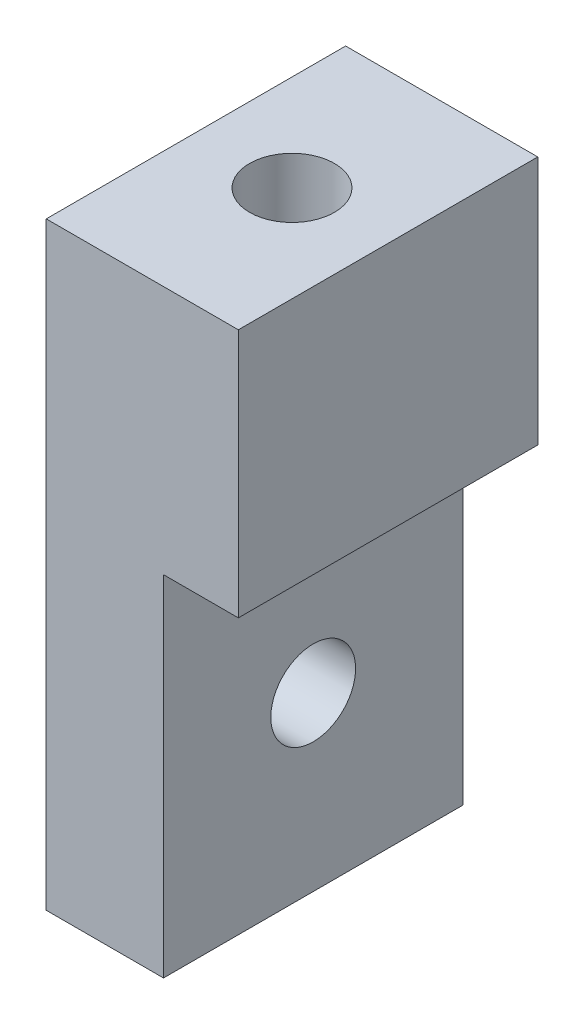
ISO-10303-21;
HEADER;
FILE_DESCRIPTION(('STEP AP214'),'2;1');
FILE_NAME('part.step','',(''),(''),'','','');
FILE_SCHEMA(('AUTOMOTIVE_DESIGN { 1 0 10303 214 1 1 1 1 }'));
ENDSEC;
DATA;
#1=APPLICATION_CONTEXT('core data for automotive mechanical design processes');
#2=APPLICATION_PROTOCOL_DEFINITION('international standard','automotive_design',2000,#1);
#3=PRODUCT_CONTEXT('',#1,'mechanical');
#4=PRODUCT('Part','Part','',(#3));
#5=PRODUCT_RELATED_PRODUCT_CATEGORY('part','',(#4));
#6=PRODUCT_DEFINITION_FORMATION('','',#4);
#7=PRODUCT_DEFINITION_CONTEXT('part definition',#1,'design');
#8=PRODUCT_DEFINITION('design','',#6,#7);
#9=PRODUCT_DEFINITION_SHAPE('','',#8);
#10=(LENGTH_UNIT() NAMED_UNIT(*) SI_UNIT(.MILLI.,.METRE.));
#11=(NAMED_UNIT(*) PLANE_ANGLE_UNIT() SI_UNIT($,.RADIAN.));
#12=(NAMED_UNIT(*) SI_UNIT($,.STERADIAN.) SOLID_ANGLE_UNIT());
#13=UNCERTAINTY_MEASURE_WITH_UNIT(LENGTH_MEASURE(1.E-05),#10,'distance_accuracy_value','');
#14=(GEOMETRIC_REPRESENTATION_CONTEXT(3) GLOBAL_UNCERTAINTY_ASSIGNED_CONTEXT((#13)) GLOBAL_UNIT_ASSIGNED_CONTEXT((#10,
#11,#12)) REPRESENTATION_CONTEXT('',''));
#15=CARTESIAN_POINT('',(0.,0.,0.));
#16=DIRECTION('',(0.,0.,1.));
#17=DIRECTION('',(1.,0.,0.));
#18=AXIS2_PLACEMENT_3D('',#15,#16,#17);
#19=CARTESIAN_POINT('',(0.425000000000001,0.,6.));
#20=DIRECTION('',(-1.,0.,0.));
#21=DIRECTION('',(0.,0.,1.));
#22=AXIS2_PLACEMENT_3D('',#19,#20,#21);
#23=PLANE('',#22);
#24=CARTESIAN_POINT('',(0.425000000000001,-2.55134747032304,3.));
#25=DIRECTION('',(-1.,0.,0.));
#26=DIRECTION('',(0.,0.,1.));
#27=AXIS2_PLACEMENT_3D('',#24,#25,#26);
#28=CIRCLE('',#27,0.85);
#29=CARTESIAN_POINT('',(0.425000000000001,-2.55134747032304,3.85));
#30=VERTEX_POINT('',#29);
#31=EDGE_CURVE('E133',#30,#30,#28,.T.);
#32=ORIENTED_EDGE('',*,*,#31,.T.);
#33=EDGE_LOOP('',(#32));
#34=FACE_BOUND('',#33,.T.);
#35=DIRECTION('',(0.,1.,0.));
#36=VECTOR('',#35,1.);
#37=CARTESIAN_POINT('',(0.425000000000001,0.,0.));
#38=LINE('',#37,#36);
#39=CARTESIAN_POINT('',(0.425000000000001,-6.,0.));
#40=VERTEX_POINT('',#39);
#41=CARTESIAN_POINT('',(0.425000000000001,1.,0.));
#42=VERTEX_POINT('',#41);
#43=EDGE_CURVE('E129',#40,#42,#38,.T.);
#44=ORIENTED_EDGE('',*,*,#43,.T.);
#45=DIRECTION('',(0.,0.,-1.));
#46=VECTOR('',#45,1.);
#47=CARTESIAN_POINT('',(0.425000000000001,1.,6.));
#48=LINE('',#47,#46);
#49=CARTESIAN_POINT('',(0.425000000000001,1.,2.26387840678323));
#50=VERTEX_POINT('',#49);
#51=EDGE_CURVE('E43',#50,#42,#48,.T.);
#52=ORIENTED_EDGE('',*,*,#51,.F.);
#53=CARTESIAN_POINT('',(0.425000000000001,1.,3.73612159321677));
#54=VERTEX_POINT('',#53);
#55=EDGE_CURVE('E42',#54,#50,#48,.T.);
#56=ORIENTED_EDGE('',*,*,#55,.F.);
#57=CARTESIAN_POINT('',(0.425000000000001,1.,6.));
#58=VERTEX_POINT('',#57);
#59=EDGE_CURVE('E11',#58,#54,#48,.T.);
#60=ORIENTED_EDGE('',*,*,#59,.F.);
#61=DIRECTION('',(0.,1.,0.));
#62=VECTOR('',#61,1.);
#63=CARTESIAN_POINT('',(0.425000000000001,0.,6.));
#64=LINE('',#63,#62);
#65=CARTESIAN_POINT('',(0.425000000000001,-6.,6.));
#66=VERTEX_POINT('',#65);
#67=EDGE_CURVE('E143',#66,#58,#64,.T.);
#68=ORIENTED_EDGE('',*,*,#67,.F.);
#69=DIRECTION('',(0.,0.,-1.));
#70=VECTOR('',#69,1.);
#71=CARTESIAN_POINT('',(0.425000000000001,-6.,6.));
#72=LINE('',#71,#70);
#73=EDGE_CURVE('E128',#66,#40,#72,.T.);
#74=ORIENTED_EDGE('',*,*,#73,.T.);
#75=EDGE_LOOP('',(#44,#52,#56,#60,#68,#74));
#76=FACE_BOUND('',#75,.T.);
#77=ADVANCED_FACE('F35',(#34,#76),#23,.F.);
#78=CARTESIAN_POINT('',(0.,1.,6.));
#79=DIRECTION('',(0.,1.,0.));
#80=DIRECTION('',(0.,0.,1.));
#81=AXIS2_PLACEMENT_3D('',#78,#79,#80);
#82=PLANE('',#81);
#83=ORIENTED_EDGE('',*,*,#59,.T.);
#84=CARTESIAN_POINT('',(0.,1.,3.));
#85=DIRECTION('',(0.,1.,0.));
#86=DIRECTION('',(0.,0.,1.));
#87=AXIS2_PLACEMENT_3D('',#84,#85,#86);
#88=CIRCLE('',#87,0.85);
#89=EDGE_CURVE('E157',#50,#54,#88,.F.);
#90=ORIENTED_EDGE('',*,*,#89,.F.);
#91=ORIENTED_EDGE('',*,*,#51,.T.);
#92=DIRECTION('',(1.,0.,0.));
#93=VECTOR('',#92,1.);
#94=CARTESIAN_POINT('',(0.,1.,0.));
#95=LINE('',#94,#93);
#96=CARTESIAN_POINT('',(1.925,1.,0.));
#97=VERTEX_POINT('',#96);
#98=EDGE_CURVE('E132',#42,#97,#95,.T.);
#99=ORIENTED_EDGE('',*,*,#98,.T.);
#100=DIRECTION('',(0.,0.,-1.));
#101=VECTOR('',#100,1.);
#102=CARTESIAN_POINT('',(1.925,1.,6.));
#103=LINE('',#102,#101);
#104=CARTESIAN_POINT('',(1.925,1.,6.));
#105=VERTEX_POINT('',#104);
#106=EDGE_CURVE('E146',#105,#97,#103,.T.);
#107=ORIENTED_EDGE('',*,*,#106,.F.);
#108=DIRECTION('',(1.,0.,0.));
#109=VECTOR('',#108,1.);
#110=CARTESIAN_POINT('',(0.,1.,6.));
#111=LINE('',#110,#109);
#112=EDGE_CURVE('E93',#58,#105,#111,.T.);
#113=ORIENTED_EDGE('',*,*,#112,.F.);
#114=EDGE_LOOP('',(#83,#90,#91,#99,#107,#113));
#115=FACE_BOUND('',#114,.T.);
#116=ADVANCED_FACE('F158',(#115),#82,.F.);
#117=CARTESIAN_POINT('',(1.925,0.,6.));
#118=DIRECTION('',(1.,0.,0.));
#119=DIRECTION('',(0.,1.,0.));
#120=AXIS2_PLACEMENT_3D('',#117,#118,#119);
#121=PLANE('',#120);
#122=DIRECTION('',(0.,-1.,0.));
#123=VECTOR('',#122,1.);
#124=CARTESIAN_POINT('',(1.925,0.,0.));
#125=LINE('',#124,#123);
#126=CARTESIAN_POINT('',(1.925,6.,0.));
#127=VERTEX_POINT('',#126);
#128=EDGE_CURVE('E136',#127,#97,#125,.T.);
#129=ORIENTED_EDGE('',*,*,#128,.F.);
#130=DIRECTION('',(0.,0.,-1.));
#131=VECTOR('',#130,1.);
#132=CARTESIAN_POINT('',(1.925,6.,6.));
#133=LINE('',#132,#131);
#134=CARTESIAN_POINT('',(1.925,6.,6.));
#135=VERTEX_POINT('',#134);
#136=EDGE_CURVE('E112',#135,#127,#133,.T.);
#137=ORIENTED_EDGE('',*,*,#136,.F.);
#138=DIRECTION('',(0.,-1.,0.));
#139=VECTOR('',#138,1.);
#140=CARTESIAN_POINT('',(1.925,0.,6.));
#141=LINE('',#140,#139);
#142=EDGE_CURVE('E122',#135,#105,#141,.T.);
#143=ORIENTED_EDGE('',*,*,#142,.T.);
#144=ORIENTED_EDGE('',*,*,#106,.T.);
#145=EDGE_LOOP('',(#129,#137,#143,#144));
#146=FACE_BOUND('',#145,.T.);
#147=ADVANCED_FACE('F165',(#146),#121,.T.);
#148=CARTESIAN_POINT('',(0.,6.,6.));
#149=DIRECTION('',(0.,1.,0.));
#150=DIRECTION('',(-1.,0.,0.));
#151=AXIS2_PLACEMENT_3D('',#148,#149,#150);
#152=PLANE('',#151);
#153=CARTESIAN_POINT('',(0.,6.,3.));
#154=DIRECTION('',(0.,1.,0.));
#155=DIRECTION('',(0.,0.,1.));
#156=AXIS2_PLACEMENT_3D('',#153,#154,#155);
#157=CIRCLE('',#156,0.85);
#158=CARTESIAN_POINT('',(0.,6.,3.85));
#159=VERTEX_POINT('',#158);
#160=EDGE_CURVE('E173',#159,#159,#157,.T.);
#161=ORIENTED_EDGE('',*,*,#160,.F.);
#162=EDGE_LOOP('',(#161));
#163=FACE_BOUND('',#162,.T.);
#164=DIRECTION('',(1.,0.,0.));
#165=VECTOR('',#164,1.);
#166=CARTESIAN_POINT('',(0.,6.,0.));
#167=LINE('',#166,#165);
#168=CARTESIAN_POINT('',(-1.925,6.,0.));
#169=VERTEX_POINT('',#168);
#170=EDGE_CURVE('E109',#169,#127,#167,.T.);
#171=ORIENTED_EDGE('',*,*,#170,.F.);
#172=DIRECTION('',(0.,0.,-1.));
#173=VECTOR('',#172,1.);
#174=CARTESIAN_POINT('',(-1.925,6.,6.));
#175=LINE('',#174,#173);
#176=CARTESIAN_POINT('',(-1.925,6.,6.));
#177=VERTEX_POINT('',#176);
#178=EDGE_CURVE('E103',#177,#169,#175,.T.);
#179=ORIENTED_EDGE('',*,*,#178,.F.);
#180=DIRECTION('',(1.,0.,0.));
#181=VECTOR('',#180,1.);
#182=CARTESIAN_POINT('',(0.,6.,6.));
#183=LINE('',#182,#181);
#184=EDGE_CURVE('E107',#177,#135,#183,.T.);
#185=ORIENTED_EDGE('',*,*,#184,.T.);
#186=ORIENTED_EDGE('',*,*,#136,.T.);
#187=EDGE_LOOP('',(#171,#179,#185,#186));
#188=FACE_BOUND('',#187,.T.);
#189=ADVANCED_FACE('F105',(#163,#188),#152,.T.);
#190=CARTESIAN_POINT('',(-1.925,0.,6.));
#191=DIRECTION('',(1.,0.,0.));
#192=DIRECTION('',(0.,1.,0.));
#193=AXIS2_PLACEMENT_3D('',#190,#191,#192);
#194=PLANE('',#193);
#195=CARTESIAN_POINT('',(-1.925,-2.55134747032304,3.));
#196=DIRECTION('',(-1.,0.,0.));
#197=DIRECTION('',(0.,-1.,0.));
#198=AXIS2_PLACEMENT_3D('',#195,#196,#197);
#199=CIRCLE('',#198,0.85);
#200=CARTESIAN_POINT('',(-1.925,-3.40134747032304,3.));
#201=VERTEX_POINT('',#200);
#202=EDGE_CURVE('E159',#201,#201,#199,.T.);
#203=ORIENTED_EDGE('',*,*,#202,.F.);
#204=EDGE_LOOP('',(#203));
#205=FACE_BOUND('',#204,.T.);
#206=DIRECTION('',(0.,-1.,0.));
#207=VECTOR('',#206,1.);
#208=CARTESIAN_POINT('',(-1.925,0.,0.));
#209=LINE('',#208,#207);
#210=CARTESIAN_POINT('',(-1.925,-6.,0.));
#211=VERTEX_POINT('',#210);
#212=EDGE_CURVE('E140',#169,#211,#209,.T.);
#213=ORIENTED_EDGE('',*,*,#212,.T.);
#214=DIRECTION('',(0.,0.,-1.));
#215=VECTOR('',#214,1.);
#216=CARTESIAN_POINT('',(-1.925,-6.,6.));
#217=LINE('',#216,#215);
#218=CARTESIAN_POINT('',(-1.925,-6.,6.));
#219=VERTEX_POINT('',#218);
#220=EDGE_CURVE('E113',#219,#211,#217,.T.);
#221=ORIENTED_EDGE('',*,*,#220,.F.);
#222=DIRECTION('',(0.,-1.,0.));
#223=VECTOR('',#222,1.);
#224=CARTESIAN_POINT('',(-1.925,0.,6.));
#225=LINE('',#224,#223);
#226=EDGE_CURVE('E116',#177,#219,#225,.T.);
#227=ORIENTED_EDGE('',*,*,#226,.F.);
#228=ORIENTED_EDGE('',*,*,#178,.T.);
#229=EDGE_LOOP('',(#213,#221,#227,#228));
#230=FACE_BOUND('',#229,.T.);
#231=ADVANCED_FACE('F117',(#205,#230),#194,.F.);
#232=CARTESIAN_POINT('',(0.,-6.,6.));
#233=DIRECTION('',(0.,1.,0.));
#234=DIRECTION('',(0.,0.,1.));
#235=AXIS2_PLACEMENT_3D('',#232,#233,#234);
#236=PLANE('',#235);
#237=DIRECTION('',(1.,0.,0.));
#238=VECTOR('',#237,1.);
#239=CARTESIAN_POINT('',(0.,-6.,0.));
#240=LINE('',#239,#238);
#241=EDGE_CURVE('E85',#211,#40,#240,.T.);
#242=ORIENTED_EDGE('',*,*,#241,.T.);
#243=ORIENTED_EDGE('',*,*,#73,.F.);
#244=DIRECTION('',(1.,0.,0.));
#245=VECTOR('',#244,1.);
#246=CARTESIAN_POINT('',(0.,-6.,6.));
#247=LINE('',#246,#245);
#248=EDGE_CURVE('E58',#219,#66,#247,.T.);
#249=ORIENTED_EDGE('',*,*,#248,.F.);
#250=ORIENTED_EDGE('',*,*,#220,.T.);
#251=EDGE_LOOP('',(#242,#243,#249,#250));
#252=FACE_BOUND('',#251,.T.);
#253=ADVANCED_FACE('F166',(#252),#236,.F.);
#254=CARTESIAN_POINT('',(0.,0.,6.));
#255=DIRECTION('',(0.,0.,1.));
#256=DIRECTION('',(1.,0.,0.));
#257=AXIS2_PLACEMENT_3D('',#254,#255,#256);
#258=PLANE('',#257);
#259=ORIENTED_EDGE('',*,*,#67,.T.);
#260=ORIENTED_EDGE('',*,*,#112,.T.);
#261=ORIENTED_EDGE('',*,*,#142,.F.);
#262=ORIENTED_EDGE('',*,*,#184,.F.);
#263=ORIENTED_EDGE('',*,*,#226,.T.);
#264=ORIENTED_EDGE('',*,*,#248,.T.);
#265=EDGE_LOOP('',(#259,#260,#261,#262,#263,#264));
#266=FACE_BOUND('',#265,.T.);
#267=ADVANCED_FACE('F120',(#266),#258,.T.);
#268=CARTESIAN_POINT('',(0.,0.,0.));
#269=DIRECTION('',(0.,0.,1.));
#270=DIRECTION('',(1.,0.,0.));
#271=AXIS2_PLACEMENT_3D('',#268,#269,#270);
#272=PLANE('',#271);
#273=ORIENTED_EDGE('',*,*,#43,.F.);
#274=ORIENTED_EDGE('',*,*,#241,.F.);
#275=ORIENTED_EDGE('',*,*,#212,.F.);
#276=ORIENTED_EDGE('',*,*,#170,.T.);
#277=ORIENTED_EDGE('',*,*,#128,.T.);
#278=ORIENTED_EDGE('',*,*,#98,.F.);
#279=EDGE_LOOP('',(#273,#274,#275,#276,#277,#278));
#280=FACE_BOUND('',#279,.T.);
#281=ADVANCED_FACE('F164',(#280),#272,.F.);
#282=CARTESIAN_POINT('',(1.925,-2.55134747032304,3.));
#283=DIRECTION('',(-1.,0.,0.));
#284=DIRECTION('',(0.,-1.,0.));
#285=AXIS2_PLACEMENT_3D('',#282,#283,#284);
#286=CYLINDRICAL_SURFACE('',#285,0.85);
#287=ORIENTED_EDGE('',*,*,#202,.T.);
#288=EDGE_LOOP('',(#287));
#289=FACE_BOUND('',#288,.T.);
#290=ORIENTED_EDGE('',*,*,#31,.F.);
#291=EDGE_LOOP('',(#290));
#292=FACE_BOUND('',#291,.T.);
#293=ADVANCED_FACE('F195',(#289,#292),#286,.F.);
#294=CARTESIAN_POINT('',(0.,1.,6.));
#295=DIRECTION('',(0.,1.,0.));
#296=DIRECTION('',(0.,0.,1.));
#297=AXIS2_PLACEMENT_3D('',#294,#295,#296);
#298=PLANE('',#297);
#299=ORIENTED_EDGE('',*,*,#55,.T.);
#300=EDGE_CURVE('E49',#54,#50,#88,.F.);
#301=ORIENTED_EDGE('',*,*,#300,.F.);
#302=EDGE_LOOP('',(#299,#301));
#303=FACE_BOUND('',#302,.T.);
#304=ADVANCED_FACE('F154',(#303),#298,.T.);
#305=CARTESIAN_POINT('',(0.,-1.40416305603426,3.));
#306=DIRECTION('',(0.,1.,0.));
#307=DIRECTION('',(0.,0.,1.));
#308=AXIS2_PLACEMENT_3D('',#305,#306,#307);
#309=CYLINDRICAL_SURFACE('',#308,0.85);
#310=ORIENTED_EDGE('',*,*,#89,.T.);
#311=ORIENTED_EDGE('',*,*,#300,.T.);
#312=EDGE_LOOP('',(#310,#311));
#313=FACE_BOUND('',#312,.T.);
#314=ORIENTED_EDGE('',*,*,#160,.T.);
#315=EDGE_LOOP('',(#314));
#316=FACE_BOUND('',#315,.T.);
#317=ADVANCED_FACE('F177',(#313,#316),#309,.F.);
#318=CLOSED_SHELL('',(#77,#116,#147,#189,#231,#253,#267,#281,#293,#304,#317));
#319=MANIFOLD_SOLID_BREP('B2',#318);
#320=ADVANCED_BREP_SHAPE_REPRESENTATION('',(#18,#319),#14);
#321=SHAPE_DEFINITION_REPRESENTATION(#9,#320);
ENDSEC;
END-ISO-10303-21;
